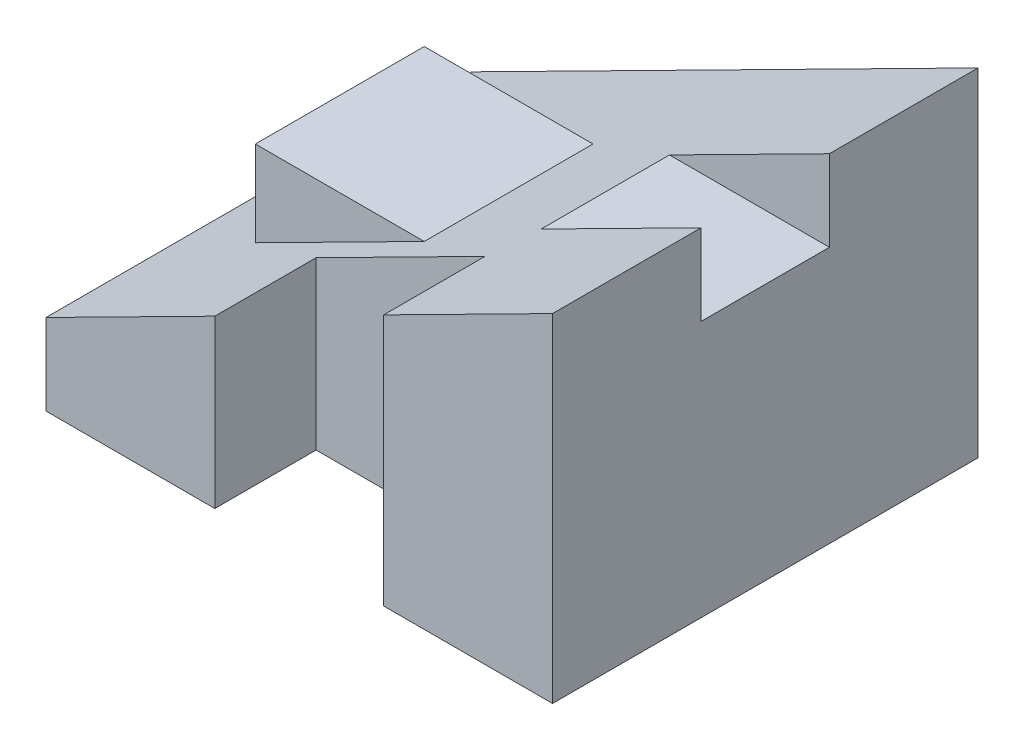
ISO-10303-21;
HEADER;
FILE_DESCRIPTION(('STEP AP214'),'2;1');
FILE_NAME('part.step','',(''),(''),'','','');
FILE_SCHEMA(('AUTOMOTIVE_DESIGN { 1 0 10303 214 1 1 1 1 }'));
ENDSEC;
DATA;
#1=APPLICATION_CONTEXT('core data for automotive mechanical design processes');
#2=APPLICATION_PROTOCOL_DEFINITION('international standard','automotive_design',2000,#1);
#3=PRODUCT_CONTEXT('',#1,'mechanical');
#4=PRODUCT('Part','Part','',(#3));
#5=PRODUCT_RELATED_PRODUCT_CATEGORY('part','',(#4));
#6=PRODUCT_DEFINITION_FORMATION('','',#4);
#7=PRODUCT_DEFINITION_CONTEXT('part definition',#1,'design');
#8=PRODUCT_DEFINITION('design','',#6,#7);
#9=PRODUCT_DEFINITION_SHAPE('','',#8);
#10=(LENGTH_UNIT() NAMED_UNIT(*) SI_UNIT(.MILLI.,.METRE.));
#11=(NAMED_UNIT(*) PLANE_ANGLE_UNIT() SI_UNIT($,.RADIAN.));
#12=(NAMED_UNIT(*) SI_UNIT($,.STERADIAN.) SOLID_ANGLE_UNIT());
#13=UNCERTAINTY_MEASURE_WITH_UNIT(LENGTH_MEASURE(1.E-05),#10,'distance_accuracy_value','');
#14=(GEOMETRIC_REPRESENTATION_CONTEXT(3) GLOBAL_UNCERTAINTY_ASSIGNED_CONTEXT((#13)) GLOBAL_UNIT_ASSIGNED_CONTEXT((#10,
#11,#12)) REPRESENTATION_CONTEXT('',''));
#15=CARTESIAN_POINT('',(0.,0.,0.));
#16=DIRECTION('',(0.,0.,1.));
#17=DIRECTION('',(1.,0.,0.));
#18=AXIS2_PLACEMENT_3D('',#15,#16,#17);
#19=CARTESIAN_POINT('',(0.,50.,-15.));
#20=DIRECTION('',(0.,0.,-1.));
#21=DIRECTION('',(-1.,0.,0.));
#22=AXIS2_PLACEMENT_3D('',#19,#20,#21);
#23=PLANE('',#22);
#24=DIRECTION('',(0.,-1.,0.));
#25=VECTOR('',#24,1.);
#26=CARTESIAN_POINT('',(50.,50.,-15.));
#27=LINE('',#26,#25);
#28=CARTESIAN_POINT('',(50.,37.3333333333333,-15.));
#29=VERTEX_POINT('',#28);
#30=CARTESIAN_POINT('',(50.,0.,-15.));
#31=VERTEX_POINT('',#30);
#32=EDGE_CURVE('E11',#29,#31,#27,.T.);
#33=ORIENTED_EDGE('',*,*,#32,.F.);
#34=DIRECTION('',(0.892035776030268,0.45196479318867,0.));
#35=VECTOR('',#34,1.);
#36=CARTESIAN_POINT('',(0.,12.,-15.));
#37=LINE('',#36,#35);
#38=CARTESIAN_POINT('',(25.,24.6666666666667,-15.));
#39=VERTEX_POINT('',#38);
#40=EDGE_CURVE('E171',#39,#29,#37,.T.);
#41=ORIENTED_EDGE('',*,*,#40,.F.);
#42=DIRECTION('',(0.,-1.,0.));
#43=VECTOR('',#42,1.);
#44=CARTESIAN_POINT('',(25.,50.,-15.));
#45=LINE('',#44,#43);
#46=CARTESIAN_POINT('',(25.,0.,-15.));
#47=VERTEX_POINT('',#46);
#48=EDGE_CURVE('E182',#39,#47,#45,.T.);
#49=ORIENTED_EDGE('',*,*,#48,.T.);
#50=DIRECTION('',(1.,0.,0.));
#51=VECTOR('',#50,1.);
#52=CARTESIAN_POINT('',(0.,0.,-15.));
#53=LINE('',#52,#51);
#54=EDGE_CURVE('E178',#47,#31,#53,.T.);
#55=ORIENTED_EDGE('',*,*,#54,.T.);
#56=EDGE_LOOP('',(#33,#41,#49,#55));
#57=FACE_BOUND('',#56,.T.);
#58=ADVANCED_FACE('F37',(#57),#23,.F.);
#59=CARTESIAN_POINT('',(50.,50.,0.));
#60=DIRECTION('',(1.,0.,0.));
#61=DIRECTION('',(0.,0.,-1.));
#62=AXIS2_PLACEMENT_3D('',#59,#60,#61);
#63=PLANE('',#62);
#64=DIRECTION('',(0.,-1.,0.));
#65=VECTOR('',#64,1.);
#66=CARTESIAN_POINT('',(50.,50.,0.));
#67=LINE('',#66,#65);
#68=CARTESIAN_POINT('',(50.,37.3333333333333,0.));
#69=VERTEX_POINT('',#68);
#70=CARTESIAN_POINT('',(50.,0.,0.));
#71=VERTEX_POINT('',#70);
#72=EDGE_CURVE('E44',#69,#71,#67,.T.);
#73=ORIENTED_EDGE('',*,*,#72,.F.);
#74=DIRECTION('',(0.,0.,1.));
#75=VECTOR('',#74,1.);
#76=CARTESIAN_POINT('',(50.,37.3333333333333,0.001000000000001));
#77=LINE('',#76,#75);
#78=EDGE_CURVE('E169',#29,#69,#77,.T.);
#79=ORIENTED_EDGE('',*,*,#78,.F.);
#80=ORIENTED_EDGE('',*,*,#32,.T.);
#81=DIRECTION('',(0.,0.,1.));
#82=VECTOR('',#81,1.);
#83=CARTESIAN_POINT('',(50.,0.,0.));
#84=LINE('',#83,#82);
#85=EDGE_CURVE('E186',#31,#71,#84,.T.);
#86=ORIENTED_EDGE('',*,*,#85,.T.);
#87=EDGE_LOOP('',(#73,#79,#80,#86));
#88=FACE_BOUND('',#87,.T.);
#89=ADVANCED_FACE('F224',(#88),#63,.F.);
#90=CARTESIAN_POINT('',(0.,50.,0.));
#91=DIRECTION('',(0.,0.,-1.));
#92=DIRECTION('',(-1.,0.,0.));
#93=AXIS2_PLACEMENT_3D('',#90,#91,#92);
#94=PLANE('',#93);
#95=DIRECTION('',(0.,-1.,0.));
#96=VECTOR('',#95,1.);
#97=CARTESIAN_POINT('',(75.,50.,0.));
#98=LINE('',#97,#96);
#99=CARTESIAN_POINT('',(75.,50.,0.));
#100=VERTEX_POINT('',#99);
#101=CARTESIAN_POINT('',(75.,0.,0.));
#102=VERTEX_POINT('',#101);
#103=EDGE_CURVE('E213',#100,#102,#98,.T.);
#104=ORIENTED_EDGE('',*,*,#103,.F.);
#105=DIRECTION('',(0.892035776030268,0.45196479318867,0.));
#106=VECTOR('',#105,1.);
#107=CARTESIAN_POINT('',(0.,12.,0.));
#108=LINE('',#107,#106);
#109=EDGE_CURVE('E167',#69,#100,#108,.T.);
#110=ORIENTED_EDGE('',*,*,#109,.F.);
#111=ORIENTED_EDGE('',*,*,#72,.T.);
#112=DIRECTION('',(1.,0.,0.));
#113=VECTOR('',#112,1.);
#114=CARTESIAN_POINT('',(0.,0.,0.));
#115=LINE('',#114,#113);
#116=EDGE_CURVE('E189',#71,#102,#115,.T.);
#117=ORIENTED_EDGE('',*,*,#116,.T.);
#118=EDGE_LOOP('',(#104,#110,#111,#117));
#119=FACE_BOUND('',#118,.T.);
#120=ADVANCED_FACE('F219',(#119),#94,.F.);
#121=CARTESIAN_POINT('',(75.,50.,0.));
#122=DIRECTION('',(-1.,0.,0.));
#123=DIRECTION('',(0.,0.,1.));
#124=AXIS2_PLACEMENT_3D('',#121,#122,#123);
#125=PLANE('',#124);
#126=DIRECTION('',(0.,0.,-1.));
#127=VECTOR('',#126,1.);
#128=CARTESIAN_POINT('',(75.,50.,0.));
#129=LINE('',#128,#127);
#130=CARTESIAN_POINT('',(75.,50.,-41.));
#131=VERTEX_POINT('',#130);
#132=CARTESIAN_POINT('',(75.,50.,-63.));
#133=VERTEX_POINT('',#132);
#134=EDGE_CURVE('E183',#131,#133,#129,.T.);
#135=ORIENTED_EDGE('',*,*,#134,.F.);
#136=DIRECTION('',(0.,1.,0.));
#137=VECTOR('',#136,1.);
#138=CARTESIAN_POINT('',(75.,38.,-41.));
#139=LINE('',#138,#137);
#140=CARTESIAN_POINT('',(75.,38.,-41.));
#141=VERTEX_POINT('',#140);
#142=EDGE_CURVE('E266',#141,#131,#139,.T.);
#143=ORIENTED_EDGE('',*,*,#142,.F.);
#144=DIRECTION('',(0.,0.,-1.));
#145=VECTOR('',#144,1.);
#146=CARTESIAN_POINT('',(75.,38.,-22.));
#147=LINE('',#146,#145);
#148=CARTESIAN_POINT('',(75.,38.,-22.));
#149=VERTEX_POINT('',#148);
#150=EDGE_CURVE('E268',#149,#141,#147,.T.);
#151=ORIENTED_EDGE('',*,*,#150,.F.);
#152=DIRECTION('',(0.,-1.,0.));
#153=VECTOR('',#152,1.);
#154=CARTESIAN_POINT('',(75.,50.,-22.));
#155=LINE('',#154,#153);
#156=CARTESIAN_POINT('',(75.,50.,-22.));
#157=VERTEX_POINT('',#156);
#158=EDGE_CURVE('E238',#157,#149,#155,.T.);
#159=ORIENTED_EDGE('',*,*,#158,.F.);
#160=EDGE_CURVE('E179',#100,#157,#129,.T.);
#161=ORIENTED_EDGE('',*,*,#160,.F.);
#162=ORIENTED_EDGE('',*,*,#103,.T.);
#163=DIRECTION('',(0.,0.,-1.));
#164=VECTOR('',#163,1.);
#165=CARTESIAN_POINT('',(75.,0.,0.));
#166=LINE('',#165,#164);
#167=CARTESIAN_POINT('',(75.,0.,-63.));
#168=VERTEX_POINT('',#167);
#169=EDGE_CURVE('E191',#102,#168,#166,.T.);
#170=ORIENTED_EDGE('',*,*,#169,.T.);
#171=DIRECTION('',(0.,-1.,0.));
#172=VECTOR('',#171,1.);
#173=CARTESIAN_POINT('',(75.,50.,-63.));
#174=LINE('',#173,#172);
#175=EDGE_CURVE('E211',#133,#168,#174,.T.);
#176=ORIENTED_EDGE('',*,*,#175,.F.);
#177=EDGE_LOOP('',(#135,#143,#151,#159,#161,#162,#170,#176));
#178=FACE_BOUND('',#177,.T.);
#179=ADVANCED_FACE('F234',(#178),#125,.F.);
#180=CARTESIAN_POINT('',(0.,50.,-63.));
#181=DIRECTION('',(0.,0.,-1.));
#182=DIRECTION('',(-1.,0.,0.));
#183=AXIS2_PLACEMENT_3D('',#180,#181,#182);
#184=PLANE('',#183);
#185=DIRECTION('',(-0.892035776030268,-0.451964793188669,0.));
#186=VECTOR('',#185,1.);
#187=CARTESIAN_POINT('',(0.,12.,-63.));
#188=LINE('',#187,#186);
#189=CARTESIAN_POINT('',(0.,12.,-63.));
#190=VERTEX_POINT('',#189);
#191=EDGE_CURVE('E173',#133,#190,#188,.T.);
#192=ORIENTED_EDGE('',*,*,#191,.F.);
#193=ORIENTED_EDGE('',*,*,#175,.T.);
#194=DIRECTION('',(1.,0.,0.));
#195=VECTOR('',#194,1.);
#196=CARTESIAN_POINT('',(0.,0.,-63.));
#197=LINE('',#196,#195);
#198=CARTESIAN_POINT('',(0.,0.,-63.));
#199=VERTEX_POINT('',#198);
#200=EDGE_CURVE('E195',#199,#168,#197,.T.);
#201=ORIENTED_EDGE('',*,*,#200,.F.);
#202=DIRECTION('',(0.,-1.,0.));
#203=VECTOR('',#202,1.);
#204=CARTESIAN_POINT('',(0.,50.,-63.));
#205=LINE('',#204,#203);
#206=EDGE_CURVE('E209',#190,#199,#205,.T.);
#207=ORIENTED_EDGE('',*,*,#206,.F.);
#208=EDGE_LOOP('',(#192,#193,#201,#207));
#209=FACE_BOUND('',#208,.T.);
#210=ADVANCED_FACE('F262',(#209),#184,.T.);
#211=CARTESIAN_POINT('',(0.,50.,0.));
#212=DIRECTION('',(-1.,0.,0.));
#213=DIRECTION('',(0.,0.,1.));
#214=AXIS2_PLACEMENT_3D('',#211,#212,#213);
#215=PLANE('',#214);
#216=DIRECTION('',(0.,0.,-1.));
#217=VECTOR('',#216,1.);
#218=CARTESIAN_POINT('',(0.,12.,0.001000000000001));
#219=LINE('',#218,#217);
#220=CARTESIAN_POINT('',(0.,12.,0.));
#221=VERTEX_POINT('',#220);
#222=EDGE_CURVE('E175',#221,#190,#219,.T.);
#223=ORIENTED_EDGE('',*,*,#222,.T.);
#224=ORIENTED_EDGE('',*,*,#206,.T.);
#225=DIRECTION('',(0.,0.,-1.));
#226=VECTOR('',#225,1.);
#227=CARTESIAN_POINT('',(0.,0.,0.));
#228=LINE('',#227,#226);
#229=CARTESIAN_POINT('',(0.,0.,0.));
#230=VERTEX_POINT('',#229);
#231=EDGE_CURVE('E198',#230,#199,#228,.T.);
#232=ORIENTED_EDGE('',*,*,#231,.F.);
#233=DIRECTION('',(0.,-1.,0.));
#234=VECTOR('',#233,1.);
#235=CARTESIAN_POINT('',(0.,50.,0.));
#236=LINE('',#235,#234);
#237=EDGE_CURVE('E207',#221,#230,#236,.T.);
#238=ORIENTED_EDGE('',*,*,#237,.F.);
#239=EDGE_LOOP('',(#223,#224,#232,#238));
#240=FACE_BOUND('',#239,.T.);
#241=ADVANCED_FACE('F258',(#240),#215,.T.);
#242=DIRECTION('',(0.,-1.,0.));
#243=VECTOR('',#242,1.);
#244=CARTESIAN_POINT('',(25.,50.,0.));
#245=LINE('',#244,#243);
#246=CARTESIAN_POINT('',(25.,24.6666666666667,0.));
#247=VERTEX_POINT('',#246);
#248=CARTESIAN_POINT('',(25.,0.,0.));
#249=VERTEX_POINT('',#248);
#250=EDGE_CURVE('E205',#247,#249,#245,.T.);
#251=ORIENTED_EDGE('',*,*,#250,.F.);
#252=DIRECTION('',(0.892035776030268,0.45196479318867,0.));
#253=VECTOR('',#252,1.);
#254=CARTESIAN_POINT('',(0.,12.,0.));
#255=LINE('',#254,#253);
#256=EDGE_CURVE('E143',#221,#247,#255,.T.);
#257=ORIENTED_EDGE('',*,*,#256,.F.);
#258=ORIENTED_EDGE('',*,*,#237,.T.);
#259=EDGE_CURVE('E192',#230,#249,#115,.T.);
#260=ORIENTED_EDGE('',*,*,#259,.T.);
#261=EDGE_LOOP('',(#251,#257,#258,#260));
#262=FACE_BOUND('',#261,.T.);
#263=ADVANCED_FACE('F255',(#262),#94,.F.);
#264=CARTESIAN_POINT('',(25.,50.,0.));
#265=DIRECTION('',(-1.,0.,0.));
#266=DIRECTION('',(0.,0.,1.));
#267=AXIS2_PLACEMENT_3D('',#264,#265,#266);
#268=PLANE('',#267);
#269=ORIENTED_EDGE('',*,*,#48,.F.);
#270=DIRECTION('',(0.,0.,-1.));
#271=VECTOR('',#270,1.);
#272=CARTESIAN_POINT('',(25.,24.6666666666667,0.001000000000001));
#273=LINE('',#272,#271);
#274=EDGE_CURVE('E158',#247,#39,#273,.T.);
#275=ORIENTED_EDGE('',*,*,#274,.F.);
#276=ORIENTED_EDGE('',*,*,#250,.T.);
#277=DIRECTION('',(0.,0.,-1.));
#278=VECTOR('',#277,1.);
#279=CARTESIAN_POINT('',(25.,0.,0.));
#280=LINE('',#279,#278);
#281=EDGE_CURVE('E201',#249,#47,#280,.T.);
#282=ORIENTED_EDGE('',*,*,#281,.T.);
#283=EDGE_LOOP('',(#269,#275,#276,#282));
#284=FACE_BOUND('',#283,.T.);
#285=ADVANCED_FACE('F250',(#284),#268,.F.);
#286=CARTESIAN_POINT('',(0.,0.,0.));
#287=DIRECTION('',(0.,1.,0.));
#288=DIRECTION('',(0.,0.,1.));
#289=AXIS2_PLACEMENT_3D('',#286,#287,#288);
#290=PLANE('',#289);
#291=ORIENTED_EDGE('',*,*,#54,.F.);
#292=ORIENTED_EDGE('',*,*,#281,.F.);
#293=ORIENTED_EDGE('',*,*,#259,.F.);
#294=ORIENTED_EDGE('',*,*,#231,.T.);
#295=ORIENTED_EDGE('',*,*,#200,.T.);
#296=ORIENTED_EDGE('',*,*,#169,.F.);
#297=ORIENTED_EDGE('',*,*,#116,.F.);
#298=ORIENTED_EDGE('',*,*,#85,.F.);
#299=EDGE_LOOP('',(#291,#292,#293,#294,#295,#296,#297,#298));
#300=FACE_BOUND('',#299,.T.);
#301=ADVANCED_FACE('F229',(#300),#290,.F.);
#302=CARTESIAN_POINT('',(0.,12.,0.001000000000001));
#303=DIRECTION('',(0.45196479318867,-0.892035776030268,0.));
#304=DIRECTION('',(0.892035776030268,0.45196479318867,0.));
#305=AXIS2_PLACEMENT_3D('',#302,#303,#304);
#306=PLANE('',#305);
#307=DIRECTION('',(0.892035776030268,0.45196479318867,0.));
#308=VECTOR('',#307,1.);
#309=CARTESIAN_POINT('',(0.,12.,-19.));
#310=LINE('',#309,#308);
#311=CARTESIAN_POINT('',(12.,18.08,-19.));
#312=VERTEX_POINT('',#311);
#313=CARTESIAN_POINT('',(37.,30.7466666666667,-19.));
#314=VERTEX_POINT('',#313);
#315=EDGE_CURVE('E144',#312,#314,#310,.T.);
#316=ORIENTED_EDGE('',*,*,#315,.F.);
#317=DIRECTION('',(0.,0.,-1.));
#318=VECTOR('',#317,1.);
#319=CARTESIAN_POINT('',(12.,18.08,0.001000000000001));
#320=LINE('',#319,#318);
#321=CARTESIAN_POINT('',(12.,18.08,-44.));
#322=VERTEX_POINT('',#321);
#323=EDGE_CURVE('E157',#312,#322,#320,.T.);
#324=ORIENTED_EDGE('',*,*,#323,.T.);
#325=DIRECTION('',(0.892035776030268,0.45196479318867,0.));
#326=VECTOR('',#325,1.);
#327=CARTESIAN_POINT('',(0.,12.,-44.));
#328=LINE('',#327,#326);
#329=CARTESIAN_POINT('',(37.,30.7466666666667,-44.));
#330=VERTEX_POINT('',#329);
#331=EDGE_CURVE('E150',#322,#330,#328,.T.);
#332=ORIENTED_EDGE('',*,*,#331,.T.);
#333=DIRECTION('',(0.,0.,-1.));
#334=VECTOR('',#333,1.);
#335=CARTESIAN_POINT('',(37.,30.7466666666667,0.001000000000001));
#336=LINE('',#335,#334);
#337=EDGE_CURVE('E134',#314,#330,#336,.T.);
#338=ORIENTED_EDGE('',*,*,#337,.F.);
#339=EDGE_LOOP('',(#316,#324,#332,#338));
#340=FACE_BOUND('',#339,.T.);
#341=DIRECTION('',(0.,0.,1.));
#342=VECTOR('',#341,1.);
#343=CARTESIAN_POINT('',(51.3157894736842,38.,-22.));
#344=LINE('',#343,#342);
#345=CARTESIAN_POINT('',(51.3157894736842,38.,-41.));
#346=VERTEX_POINT('',#345);
#347=CARTESIAN_POINT('',(51.3157894736842,38.,-22.));
#348=VERTEX_POINT('',#347);
#349=EDGE_CURVE('E278',#346,#348,#344,.T.);
#350=ORIENTED_EDGE('',*,*,#349,.F.);
#351=DIRECTION('',(-0.892035776030268,-0.45196479318867,0.));
#352=VECTOR('',#351,1.);
#353=CARTESIAN_POINT('',(10.4815921629651,17.310673362569,-41.));
#354=LINE('',#353,#352);
#355=EDGE_CURVE('E264',#131,#346,#354,.T.);
#356=ORIENTED_EDGE('',*,*,#355,.F.);
#357=ORIENTED_EDGE('',*,*,#134,.T.);
#358=ORIENTED_EDGE('',*,*,#191,.T.);
#359=ORIENTED_EDGE('',*,*,#222,.F.);
#360=ORIENTED_EDGE('',*,*,#256,.T.);
#361=ORIENTED_EDGE('',*,*,#274,.T.);
#362=ORIENTED_EDGE('',*,*,#40,.T.);
#363=ORIENTED_EDGE('',*,*,#78,.T.);
#364=ORIENTED_EDGE('',*,*,#109,.T.);
#365=ORIENTED_EDGE('',*,*,#160,.T.);
#366=DIRECTION('',(0.892035776030268,0.45196479318867,0.));
#367=VECTOR('',#366,1.);
#368=CARTESIAN_POINT('',(15.31961734333,19.7619394539539,-22.));
#369=LINE('',#368,#367);
#370=EDGE_CURVE('E241',#348,#157,#369,.T.);
#371=ORIENTED_EDGE('',*,*,#370,.F.);
#372=EDGE_LOOP('',(#350,#356,#357,#358,#359,#360,#361,#362,#363,#364,#365,#371));
#373=FACE_BOUND('',#372,.T.);
#374=ADVANCED_FACE('F154',(#340,#373),#306,.F.);
#375=CARTESIAN_POINT('',(-0.001000000000001,38.,-41.));
#376=DIRECTION('',(0.,0.,-1.));
#377=DIRECTION('',(-1.,0.,0.));
#378=AXIS2_PLACEMENT_3D('',#375,#376,#377);
#379=PLANE('',#378);
#380=ORIENTED_EDGE('',*,*,#355,.T.);
#381=DIRECTION('',(1.,0.,0.));
#382=VECTOR('',#381,1.);
#383=CARTESIAN_POINT('',(-0.001000000000001,38.,-41.));
#384=LINE('',#383,#382);
#385=EDGE_CURVE('E161',#346,#141,#384,.T.);
#386=ORIENTED_EDGE('',*,*,#385,.T.);
#387=ORIENTED_EDGE('',*,*,#142,.T.);
#388=EDGE_LOOP('',(#380,#386,#387));
#389=FACE_BOUND('',#388,.T.);
#390=ADVANCED_FACE('F275',(#389),#379,.F.);
#391=CARTESIAN_POINT('',(-0.001000000000001,38.,-22.));
#392=DIRECTION('',(0.,-1.,0.));
#393=DIRECTION('',(0.,0.,-1.));
#394=AXIS2_PLACEMENT_3D('',#391,#392,#393);
#395=PLANE('',#394);
#396=ORIENTED_EDGE('',*,*,#349,.T.);
#397=DIRECTION('',(1.,0.,0.));
#398=VECTOR('',#397,1.);
#399=CARTESIAN_POINT('',(-0.001000000000001,38.,-22.));
#400=LINE('',#399,#398);
#401=EDGE_CURVE('E59',#348,#149,#400,.T.);
#402=ORIENTED_EDGE('',*,*,#401,.T.);
#403=ORIENTED_EDGE('',*,*,#150,.T.);
#404=ORIENTED_EDGE('',*,*,#385,.F.);
#405=EDGE_LOOP('',(#396,#402,#403,#404));
#406=FACE_BOUND('',#405,.T.);
#407=ADVANCED_FACE('F277',(#406),#395,.F.);
#408=CARTESIAN_POINT('',(-0.001000000000001,50.,-22.));
#409=DIRECTION('',(0.,0.,1.));
#410=DIRECTION('',(1.,0.,0.));
#411=AXIS2_PLACEMENT_3D('',#408,#409,#410);
#412=PLANE('',#411);
#413=ORIENTED_EDGE('',*,*,#370,.T.);
#414=ORIENTED_EDGE('',*,*,#158,.T.);
#415=ORIENTED_EDGE('',*,*,#401,.F.);
#416=EDGE_LOOP('',(#413,#414,#415));
#417=FACE_BOUND('',#416,.T.);
#418=ADVANCED_FACE('F279',(#417),#412,.F.);
#419=CARTESIAN_POINT('',(12.,31.,0.));
#420=DIRECTION('',(-1.,0.,0.));
#421=DIRECTION('',(0.,0.,1.));
#422=AXIS2_PLACEMENT_3D('',#419,#420,#421);
#423=PLANE('',#422);
#424=DIRECTION('',(0.,0.,1.));
#425=VECTOR('',#424,1.);
#426=CARTESIAN_POINT('',(12.,30.7466666666667,-63.001));
#427=LINE('',#426,#425);
#428=CARTESIAN_POINT('',(12.,30.7466666666667,-44.));
#429=VERTEX_POINT('',#428);
#430=CARTESIAN_POINT('',(12.,30.7466666666667,-19.));
#431=VERTEX_POINT('',#430);
#432=EDGE_CURVE('E51',#429,#431,#427,.T.);
#433=ORIENTED_EDGE('',*,*,#432,.F.);
#434=DIRECTION('',(0.,-1.,0.));
#435=VECTOR('',#434,1.);
#436=CARTESIAN_POINT('',(12.,31.,-44.));
#437=LINE('',#436,#435);
#438=EDGE_CURVE('E152',#429,#322,#437,.T.);
#439=ORIENTED_EDGE('',*,*,#438,.T.);
#440=ORIENTED_EDGE('',*,*,#323,.F.);
#441=DIRECTION('',(0.,-1.,0.));
#442=VECTOR('',#441,1.);
#443=CARTESIAN_POINT('',(12.,31.,-19.));
#444=LINE('',#443,#442);
#445=EDGE_CURVE('E285',#431,#312,#444,.T.);
#446=ORIENTED_EDGE('',*,*,#445,.F.);
#447=EDGE_LOOP('',(#433,#439,#440,#446));
#448=FACE_BOUND('',#447,.T.);
#449=ADVANCED_FACE('F292',(#448),#423,.T.);
#450=CARTESIAN_POINT('',(0.,31.,-44.));
#451=DIRECTION('',(0.,0.,-1.));
#452=DIRECTION('',(-1.,0.,0.));
#453=AXIS2_PLACEMENT_3D('',#450,#451,#452);
#454=PLANE('',#453);
#455=DIRECTION('',(1.,0.,0.));
#456=VECTOR('',#455,1.);
#457=CARTESIAN_POINT('',(37.,30.7466666666667,-44.));
#458=LINE('',#457,#456);
#459=EDGE_CURVE('E137',#429,#330,#458,.T.);
#460=ORIENTED_EDGE('',*,*,#459,.T.);
#461=ORIENTED_EDGE('',*,*,#331,.F.);
#462=ORIENTED_EDGE('',*,*,#438,.F.);
#463=EDGE_LOOP('',(#460,#461,#462));
#464=FACE_BOUND('',#463,.T.);
#465=ADVANCED_FACE('F149',(#464),#454,.T.);
#466=CARTESIAN_POINT('',(0.,31.,-19.));
#467=DIRECTION('',(0.,0.,-1.));
#468=DIRECTION('',(-1.,0.,0.));
#469=AXIS2_PLACEMENT_3D('',#466,#467,#468);
#470=PLANE('',#469);
#471=ORIENTED_EDGE('',*,*,#315,.T.);
#472=DIRECTION('',(1.,0.,0.));
#473=VECTOR('',#472,1.);
#474=CARTESIAN_POINT('',(37.,30.7466666666667,-19.));
#475=LINE('',#474,#473);
#476=EDGE_CURVE('E138',#431,#314,#475,.T.);
#477=ORIENTED_EDGE('',*,*,#476,.F.);
#478=ORIENTED_EDGE('',*,*,#445,.T.);
#479=EDGE_LOOP('',(#471,#477,#478));
#480=FACE_BOUND('',#479,.T.);
#481=ADVANCED_FACE('F290',(#480),#470,.F.);
#482=CARTESIAN_POINT('',(37.,30.7466666666667,-63.001));
#483=DIRECTION('',(0.,-1.,0.));
#484=DIRECTION('',(0.,0.,-1.));
#485=AXIS2_PLACEMENT_3D('',#482,#483,#484);
#486=PLANE('',#485);
#487=ORIENTED_EDGE('',*,*,#432,.T.);
#488=ORIENTED_EDGE('',*,*,#476,.T.);
#489=ORIENTED_EDGE('',*,*,#337,.T.);
#490=ORIENTED_EDGE('',*,*,#459,.F.);
#491=EDGE_LOOP('',(#487,#488,#489,#490));
#492=FACE_BOUND('',#491,.T.);
#493=ADVANCED_FACE('F136',(#492),#486,.F.);
#494=CLOSED_SHELL('',(#58,#89,#120,#179,#210,#241,#263,#285,#301,#374,#390,#407,#418,#449,#465,
#481,#493));
#495=MANIFOLD_SOLID_BREP('B2',#494);
#496=ADVANCED_BREP_SHAPE_REPRESENTATION('',(#18,#495),#14);
#497=SHAPE_DEFINITION_REPRESENTATION(#9,#496);
ENDSEC;
END-ISO-10303-21;
